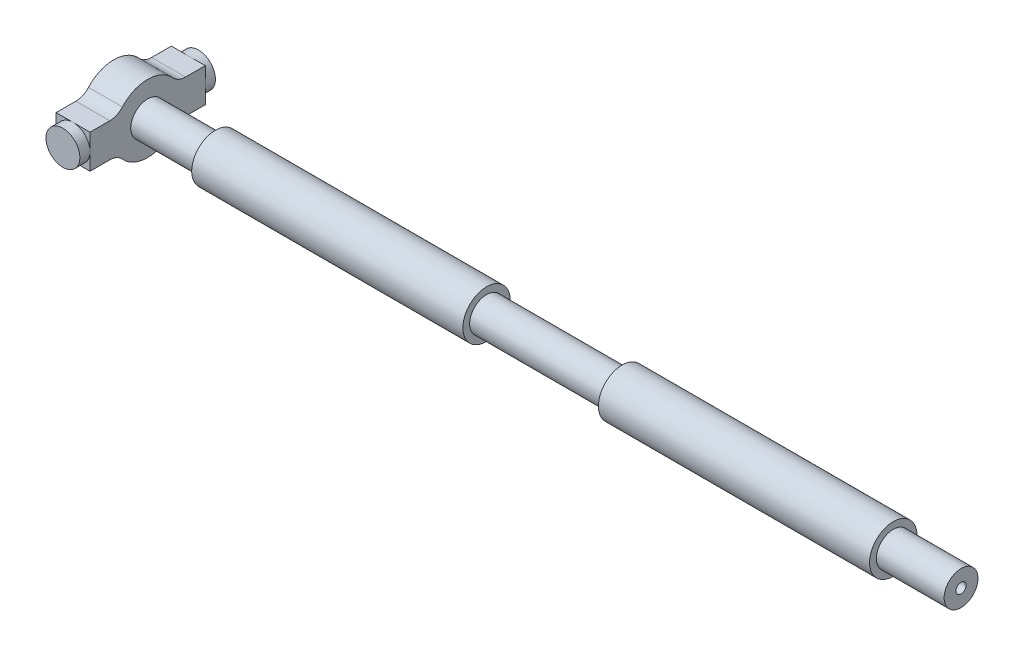
ISO-10303-21;
HEADER;
FILE_DESCRIPTION(('STEP AP214'),'2;1');
FILE_NAME('part.step','',(''),(''),'','','');
FILE_SCHEMA(('AUTOMOTIVE_DESIGN { 1 0 10303 214 1 1 1 1 }'));
ENDSEC;
DATA;
#1=APPLICATION_CONTEXT('core data for automotive mechanical design processes');
#2=APPLICATION_PROTOCOL_DEFINITION('international standard','automotive_design',2000,#1);
#3=PRODUCT_CONTEXT('',#1,'mechanical');
#4=PRODUCT('Part','Part','',(#3));
#5=PRODUCT_RELATED_PRODUCT_CATEGORY('part','',(#4));
#6=PRODUCT_DEFINITION_FORMATION('','',#4);
#7=PRODUCT_DEFINITION_CONTEXT('part definition',#1,'design');
#8=PRODUCT_DEFINITION('design','',#6,#7);
#9=PRODUCT_DEFINITION_SHAPE('','',#8);
#10=(LENGTH_UNIT() NAMED_UNIT(*) SI_UNIT(.MILLI.,.METRE.));
#11=(NAMED_UNIT(*) PLANE_ANGLE_UNIT() SI_UNIT($,.RADIAN.));
#12=(NAMED_UNIT(*) SI_UNIT($,.STERADIAN.) SOLID_ANGLE_UNIT());
#13=UNCERTAINTY_MEASURE_WITH_UNIT(LENGTH_MEASURE(1.E-05),#10,'distance_accuracy_value','');
#14=(GEOMETRIC_REPRESENTATION_CONTEXT(3) GLOBAL_UNCERTAINTY_ASSIGNED_CONTEXT((#13)) GLOBAL_UNIT_ASSIGNED_CONTEXT((#10,
#11,#12)) REPRESENTATION_CONTEXT('',''));
#15=CARTESIAN_POINT('',(0.,0.,0.));
#16=DIRECTION('',(0.,0.,1.));
#17=DIRECTION('',(1.,0.,0.));
#18=AXIS2_PLACEMENT_3D('',#15,#16,#17);
#19=CARTESIAN_POINT('',(5.,0.,-20.));
#20=DIRECTION('',(0.,0.,1.));
#21=DIRECTION('',(1.,0.,0.));
#22=AXIS2_PLACEMENT_3D('',#19,#20,#21);
#23=CYLINDRICAL_SURFACE('',#22,5.);
#24=CARTESIAN_POINT('',(5.,0.,-20.));
#25=DIRECTION('',(0.,0.,-1.));
#26=DIRECTION('',(-1.,0.,0.));
#27=AXIS2_PLACEMENT_3D('',#24,#25,#26);
#28=CIRCLE('',#27,5.);
#29=CARTESIAN_POINT('',(0.,0.,-20.));
#30=VERTEX_POINT('',#29);
#31=EDGE_CURVE('E11',#30,#30,#28,.T.);
#32=ORIENTED_EDGE('',*,*,#31,.F.);
#33=EDGE_LOOP('',(#32));
#34=FACE_BOUND('',#33,.T.);
#35=CARTESIAN_POINT('',(5.,0.,-17.));
#36=DIRECTION('',(0.,0.,-1.));
#37=DIRECTION('',(-1.,0.,0.));
#38=AXIS2_PLACEMENT_3D('',#35,#36,#37);
#39=CIRCLE('',#38,5.);
#40=CARTESIAN_POINT('',(0.,0.,-17.));
#41=VERTEX_POINT('',#40);
#42=EDGE_CURVE('E44',#41,#41,#39,.T.);
#43=ORIENTED_EDGE('',*,*,#42,.T.);
#44=EDGE_LOOP('',(#43));
#45=FACE_BOUND('',#44,.T.);
#46=ADVANCED_FACE('F41',(#34,#45),#23,.T.);
#47=CARTESIAN_POINT('',(5.,0.,-20.));
#48=DIRECTION('',(0.,0.,-1.));
#49=DIRECTION('',(-1.,0.,0.));
#50=AXIS2_PLACEMENT_3D('',#47,#48,#49);
#51=PLANE('',#50);
#52=ORIENTED_EDGE('',*,*,#31,.T.);
#53=EDGE_LOOP('',(#52));
#54=FACE_BOUND('',#53,.T.);
#55=ADVANCED_FACE('F56',(#54),#51,.T.);
#56=CARTESIAN_POINT('',(5.,0.,-17.));
#57=DIRECTION('',(0.,0.,-1.));
#58=DIRECTION('',(-1.,0.,0.));
#59=AXIS2_PLACEMENT_3D('',#56,#57,#58);
#60=PLANE('',#59);
#61=ORIENTED_EDGE('',*,*,#42,.F.);
#62=EDGE_LOOP('',(#61));
#63=FACE_BOUND('',#62,.T.);
#64=ADVANCED_FACE('F54',(#63),#60,.F.);
#65=CLOSED_SHELL('',(#46,#55,#64));
#66=MANIFOLD_SOLID_BREP('B2',#65);
#67=CARTESIAN_POINT('',(5.,0.,20.));
#68=DIRECTION('',(0.,0.,-1.));
#69=DIRECTION('',(-1.,0.,0.));
#70=AXIS2_PLACEMENT_3D('',#67,#68,#69);
#71=CYLINDRICAL_SURFACE('',#70,5.);
#72=CARTESIAN_POINT('',(5.,0.,20.));
#73=DIRECTION('',(0.,0.,1.));
#74=DIRECTION('',(1.,0.,0.));
#75=AXIS2_PLACEMENT_3D('',#72,#73,#74);
#76=CIRCLE('',#75,5.);
#77=CARTESIAN_POINT('',(10.,0.,20.));
#78=VERTEX_POINT('',#77);
#79=EDGE_CURVE('E40',#78,#78,#76,.T.);
#80=ORIENTED_EDGE('',*,*,#79,.F.);
#81=EDGE_LOOP('',(#80));
#82=FACE_BOUND('',#81,.T.);
#83=CARTESIAN_POINT('',(5.,0.,17.));
#84=DIRECTION('',(0.,0.,1.));
#85=DIRECTION('',(1.,0.,0.));
#86=AXIS2_PLACEMENT_3D('',#83,#84,#85);
#87=CIRCLE('',#86,5.);
#88=CARTESIAN_POINT('',(10.,0.,17.));
#89=VERTEX_POINT('',#88);
#90=EDGE_CURVE('E94',#89,#89,#87,.T.);
#91=ORIENTED_EDGE('',*,*,#90,.T.);
#92=EDGE_LOOP('',(#91));
#93=FACE_BOUND('',#92,.T.);
#94=ADVANCED_FACE('F91',(#82,#93),#71,.T.);
#95=CARTESIAN_POINT('',(5.,0.,20.));
#96=DIRECTION('',(0.,0.,1.));
#97=DIRECTION('',(1.,0.,0.));
#98=AXIS2_PLACEMENT_3D('',#95,#96,#97);
#99=PLANE('',#98);
#100=ORIENTED_EDGE('',*,*,#79,.T.);
#101=EDGE_LOOP('',(#100));
#102=FACE_BOUND('',#101,.T.);
#103=ADVANCED_FACE('F106',(#102),#99,.T.);
#104=CARTESIAN_POINT('',(5.,0.,17.));
#105=DIRECTION('',(0.,0.,1.));
#106=DIRECTION('',(1.,0.,0.));
#107=AXIS2_PLACEMENT_3D('',#104,#105,#106);
#108=PLANE('',#107);
#109=ORIENTED_EDGE('',*,*,#90,.F.);
#110=EDGE_LOOP('',(#109));
#111=FACE_BOUND('',#110,.T.);
#112=ADVANCED_FACE('F104',(#111),#108,.F.);
#113=CLOSED_SHELL('',(#94,#103,#112));
#114=MANIFOLD_SOLID_BREP('B6',#113);
#115=CARTESIAN_POINT('',(10.,-5.,8.66025403784439));
#116=DIRECTION('',(0.,-1.,0.));
#117=DIRECTION('',(0.,0.,-1.));
#118=AXIS2_PLACEMENT_3D('',#115,#116,#117);
#119=PLANE('',#118);
#120=DIRECTION('',(0.,0.,1.));
#121=VECTOR('',#120,1.);
#122=CARTESIAN_POINT('',(0.,-5.,8.66025403784439));
#123=LINE('',#122,#121);
#124=CARTESIAN_POINT('',(0.,-5.,11.180339887499));
#125=VERTEX_POINT('',#124);
#126=CARTESIAN_POINT('',(0.,-5.,17.));
#127=VERTEX_POINT('',#126);
#128=EDGE_CURVE('E266',#125,#127,#123,.T.);
#129=ORIENTED_EDGE('',*,*,#128,.F.);
#130=DIRECTION('',(1.,0.,0.));
#131=VECTOR('',#130,1.);
#132=CARTESIAN_POINT('',(10.,-5.,11.180339887499));
#133=LINE('',#132,#131);
#134=CARTESIAN_POINT('',(10.,-5.,11.180339887499));
#135=VERTEX_POINT('',#134);
#136=EDGE_CURVE('E231',#125,#135,#133,.T.);
#137=ORIENTED_EDGE('',*,*,#136,.T.);
#138=DIRECTION('',(0.,0.,1.));
#139=VECTOR('',#138,1.);
#140=CARTESIAN_POINT('',(10.,-5.,8.66025403784439));
#141=LINE('',#140,#139);
#142=CARTESIAN_POINT('',(10.,-5.,17.));
#143=VERTEX_POINT('',#142);
#144=EDGE_CURVE('E225',#135,#143,#141,.T.);
#145=ORIENTED_EDGE('',*,*,#144,.T.);
#146=DIRECTION('',(-1.,0.,0.));
#147=VECTOR('',#146,1.);
#148=CARTESIAN_POINT('',(10.,-5.,17.));
#149=LINE('',#148,#147);
#150=EDGE_CURVE('E228',#143,#127,#149,.T.);
#151=ORIENTED_EDGE('',*,*,#150,.T.);
#152=EDGE_LOOP('',(#129,#137,#145,#151));
#153=FACE_BOUND('',#152,.T.);
#154=ADVANCED_FACE('F138',(#153),#119,.T.);
#155=CARTESIAN_POINT('',(10.,0.,0.));
#156=DIRECTION('',(-1.,0.,0.));
#157=DIRECTION('',(0.,0.,1.));
#158=AXIS2_PLACEMENT_3D('',#155,#156,#157);
#159=CYLINDRICAL_SURFACE('',#158,10.);
#160=CARTESIAN_POINT('',(10.,0.,0.));
#161=DIRECTION('',(-1.,0.,0.));
#162=DIRECTION('',(0.,0.,1.));
#163=AXIS2_PLACEMENT_3D('',#160,#161,#162);
#164=CIRCLE('',#163,10.);
#165=CARTESIAN_POINT('',(10.,-6.66666666666667,-7.4535599249993));
#166=VERTEX_POINT('',#165);
#167=CARTESIAN_POINT('',(10.,-6.66666666666667,7.4535599249993));
#168=VERTEX_POINT('',#167);
#169=EDGE_CURVE('E244',#166,#168,#164,.T.);
#170=ORIENTED_EDGE('',*,*,#169,.T.);
#171=DIRECTION('',(-1.,0.,0.));
#172=VECTOR('',#171,1.);
#173=CARTESIAN_POINT('',(10.,-6.66666666666667,7.4535599249993));
#174=LINE('',#173,#172);
#175=CARTESIAN_POINT('',(0.,-6.66666666666667,7.4535599249993));
#176=VERTEX_POINT('',#175);
#177=EDGE_CURVE('E292',#168,#176,#174,.T.);
#178=ORIENTED_EDGE('',*,*,#177,.T.);
#179=CARTESIAN_POINT('',(0.,0.,0.));
#180=DIRECTION('',(-1.,0.,0.));
#181=DIRECTION('',(0.,0.,1.));
#182=AXIS2_PLACEMENT_3D('',#179,#180,#181);
#183=CIRCLE('',#182,10.);
#184=CARTESIAN_POINT('',(0.,-6.66666666666667,-7.4535599249993));
#185=VERTEX_POINT('',#184);
#186=EDGE_CURVE('E236',#185,#176,#183,.T.);
#187=ORIENTED_EDGE('',*,*,#186,.F.);
#188=DIRECTION('',(-1.,0.,0.));
#189=VECTOR('',#188,1.);
#190=CARTESIAN_POINT('',(10.,-6.66666666666667,-7.4535599249993));
#191=LINE('',#190,#189);
#192=EDGE_CURVE('E286',#185,#166,#191,.F.);
#193=ORIENTED_EDGE('',*,*,#192,.T.);
#194=EDGE_LOOP('',(#170,#178,#187,#193));
#195=FACE_BOUND('',#194,.T.);
#196=ADVANCED_FACE('F353',(#195),#159,.T.);
#197=CARTESIAN_POINT('',(10.,-5.,-17.));
#198=DIRECTION('',(0.,-1.,0.));
#199=DIRECTION('',(0.,0.,-1.));
#200=AXIS2_PLACEMENT_3D('',#197,#198,#199);
#201=PLANE('',#200);
#202=DIRECTION('',(0.,0.,1.));
#203=VECTOR('',#202,1.);
#204=CARTESIAN_POINT('',(10.,-5.,-17.));
#205=LINE('',#204,#203);
#206=CARTESIAN_POINT('',(10.,-5.,-17.));
#207=VERTEX_POINT('',#206);
#208=CARTESIAN_POINT('',(10.,-5.,-11.1803398874989));
#209=VERTEX_POINT('',#208);
#210=EDGE_CURVE('E261',#207,#209,#205,.T.);
#211=ORIENTED_EDGE('',*,*,#210,.T.);
#212=DIRECTION('',(1.,0.,0.));
#213=VECTOR('',#212,1.);
#214=CARTESIAN_POINT('',(0.,-5.,-11.1803398874989));
#215=LINE('',#214,#213);
#216=CARTESIAN_POINT('',(0.,-5.,-11.1803398874989));
#217=VERTEX_POINT('',#216);
#218=EDGE_CURVE('E296',#209,#217,#215,.F.);
#219=ORIENTED_EDGE('',*,*,#218,.T.);
#220=DIRECTION('',(0.,0.,1.));
#221=VECTOR('',#220,1.);
#222=CARTESIAN_POINT('',(0.,-5.,-17.));
#223=LINE('',#222,#221);
#224=CARTESIAN_POINT('',(0.,-5.,-17.));
#225=VERTEX_POINT('',#224);
#226=EDGE_CURVE('E279',#225,#217,#223,.T.);
#227=ORIENTED_EDGE('',*,*,#226,.F.);
#228=DIRECTION('',(-1.,0.,0.));
#229=VECTOR('',#228,1.);
#230=CARTESIAN_POINT('',(10.,-5.,-17.));
#231=LINE('',#230,#229);
#232=EDGE_CURVE('E284',#207,#225,#231,.T.);
#233=ORIENTED_EDGE('',*,*,#232,.F.);
#234=EDGE_LOOP('',(#211,#219,#227,#233));
#235=FACE_BOUND('',#234,.T.);
#236=ADVANCED_FACE('F345',(#235),#201,.T.);
#237=CARTESIAN_POINT('',(10.,5.,-17.));
#238=DIRECTION('',(0.,0.,-1.));
#239=DIRECTION('',(-1.,0.,0.));
#240=AXIS2_PLACEMENT_3D('',#237,#238,#239);
#241=PLANE('',#240);
#242=DIRECTION('',(0.,-1.,0.));
#243=VECTOR('',#242,1.);
#244=CARTESIAN_POINT('',(0.,5.,-17.));
#245=LINE('',#244,#243);
#246=CARTESIAN_POINT('',(0.,5.,-17.));
#247=VERTEX_POINT('',#246);
#248=EDGE_CURVE('E276',#247,#225,#245,.T.);
#249=ORIENTED_EDGE('',*,*,#248,.F.);
#250=DIRECTION('',(-1.,0.,0.));
#251=VECTOR('',#250,1.);
#252=CARTESIAN_POINT('',(10.,5.,-17.));
#253=LINE('',#252,#251);
#254=CARTESIAN_POINT('',(10.,5.,-17.));
#255=VERTEX_POINT('',#254);
#256=EDGE_CURVE('E287',#255,#247,#253,.T.);
#257=ORIENTED_EDGE('',*,*,#256,.F.);
#258=DIRECTION('',(0.,-1.,0.));
#259=VECTOR('',#258,1.);
#260=CARTESIAN_POINT('',(10.,5.,-17.));
#261=LINE('',#260,#259);
#262=EDGE_CURVE('E258',#255,#207,#261,.T.);
#263=ORIENTED_EDGE('',*,*,#262,.T.);
#264=ORIENTED_EDGE('',*,*,#232,.T.);
#265=EDGE_LOOP('',(#249,#257,#263,#264));
#266=FACE_BOUND('',#265,.T.);
#267=ADVANCED_FACE('F341',(#266),#241,.T.);
#268=CARTESIAN_POINT('',(10.,5.,-17.));
#269=DIRECTION('',(0.,1.,0.));
#270=DIRECTION('',(0.,0.,1.));
#271=AXIS2_PLACEMENT_3D('',#268,#269,#270);
#272=PLANE('',#271);
#273=DIRECTION('',(0.,0.,-1.));
#274=VECTOR('',#273,1.);
#275=CARTESIAN_POINT('',(0.,5.,-17.));
#276=LINE('',#275,#274);
#277=CARTESIAN_POINT('',(0.,5.,-11.1803398874989));
#278=VERTEX_POINT('',#277);
#279=EDGE_CURVE('E274',#278,#247,#276,.T.);
#280=ORIENTED_EDGE('',*,*,#279,.F.);
#281=DIRECTION('',(1.,0.,0.));
#282=VECTOR('',#281,1.);
#283=CARTESIAN_POINT('',(10.,5.,-11.1803398874989));
#284=LINE('',#283,#282);
#285=CARTESIAN_POINT('',(10.,5.,-11.1803398874989));
#286=VERTEX_POINT('',#285);
#287=EDGE_CURVE('E153',#278,#286,#284,.T.);
#288=ORIENTED_EDGE('',*,*,#287,.T.);
#289=DIRECTION('',(0.,0.,-1.));
#290=VECTOR('',#289,1.);
#291=CARTESIAN_POINT('',(10.,5.,-17.));
#292=LINE('',#291,#290);
#293=EDGE_CURVE('E256',#286,#255,#292,.T.);
#294=ORIENTED_EDGE('',*,*,#293,.T.);
#295=ORIENTED_EDGE('',*,*,#256,.T.);
#296=EDGE_LOOP('',(#280,#288,#294,#295));
#297=FACE_BOUND('',#296,.T.);
#298=ADVANCED_FACE('F338',(#297),#272,.T.);
#299=CARTESIAN_POINT('',(10.,0.,0.));
#300=DIRECTION('',(-1.,0.,0.));
#301=DIRECTION('',(0.,0.,1.));
#302=AXIS2_PLACEMENT_3D('',#299,#300,#301);
#303=CYLINDRICAL_SURFACE('',#302,10.);
#304=CARTESIAN_POINT('',(0.,0.,0.));
#305=DIRECTION('',(-1.,0.,0.));
#306=DIRECTION('',(0.,0.,1.));
#307=AXIS2_PLACEMENT_3D('',#304,#305,#306);
#308=CIRCLE('',#307,10.);
#309=CARTESIAN_POINT('',(0.,6.66666666666667,7.4535599249993));
#310=VERTEX_POINT('',#309);
#311=CARTESIAN_POINT('',(0.,6.66666666666667,-7.4535599249993));
#312=VERTEX_POINT('',#311);
#313=EDGE_CURVE('E272',#310,#312,#308,.T.);
#314=ORIENTED_EDGE('',*,*,#313,.F.);
#315=DIRECTION('',(-1.,0.,0.));
#316=VECTOR('',#315,1.);
#317=CARTESIAN_POINT('',(10.,6.66666666666667,7.4535599249993));
#318=LINE('',#317,#316);
#319=CARTESIAN_POINT('',(10.,6.66666666666667,7.4535599249993));
#320=VERTEX_POINT('',#319);
#321=EDGE_CURVE('E305',#310,#320,#318,.F.);
#322=ORIENTED_EDGE('',*,*,#321,.T.);
#323=CARTESIAN_POINT('',(10.,0.,0.));
#324=DIRECTION('',(-1.,0.,0.));
#325=DIRECTION('',(0.,0.,1.));
#326=AXIS2_PLACEMENT_3D('',#323,#324,#325);
#327=CIRCLE('',#326,10.);
#328=CARTESIAN_POINT('',(10.,6.66666666666667,-7.4535599249993));
#329=VERTEX_POINT('',#328);
#330=EDGE_CURVE('E251',#320,#329,#327,.T.);
#331=ORIENTED_EDGE('',*,*,#330,.T.);
#332=DIRECTION('',(-1.,0.,0.));
#333=VECTOR('',#332,1.);
#334=CARTESIAN_POINT('',(10.,6.66666666666667,-7.4535599249993));
#335=LINE('',#334,#333);
#336=EDGE_CURVE('E302',#329,#312,#335,.T.);
#337=ORIENTED_EDGE('',*,*,#336,.T.);
#338=EDGE_LOOP('',(#314,#322,#331,#337));
#339=FACE_BOUND('',#338,.T.);
#340=ADVANCED_FACE('F331',(#339),#303,.T.);
#341=CARTESIAN_POINT('',(10.,5.,8.66025403784439));
#342=DIRECTION('',(0.,1.,0.));
#343=DIRECTION('',(0.,0.,1.));
#344=AXIS2_PLACEMENT_3D('',#341,#342,#343);
#345=PLANE('',#344);
#346=DIRECTION('',(0.,0.,-1.));
#347=VECTOR('',#346,1.);
#348=CARTESIAN_POINT('',(10.,5.,8.66025403784439));
#349=LINE('',#348,#347);
#350=CARTESIAN_POINT('',(10.,5.,17.));
#351=VERTEX_POINT('',#350);
#352=CARTESIAN_POINT('',(10.,5.,11.1803398874989));
#353=VERTEX_POINT('',#352);
#354=EDGE_CURVE('E249',#351,#353,#349,.T.);
#355=ORIENTED_EDGE('',*,*,#354,.T.);
#356=DIRECTION('',(1.,0.,0.));
#357=VECTOR('',#356,1.);
#358=CARTESIAN_POINT('',(0.,5.,11.1803398874989));
#359=LINE('',#358,#357);
#360=CARTESIAN_POINT('',(0.,5.,11.1803398874989));
#361=VERTEX_POINT('',#360);
#362=EDGE_CURVE('E299',#353,#361,#359,.F.);
#363=ORIENTED_EDGE('',*,*,#362,.T.);
#364=DIRECTION('',(0.,0.,-1.));
#365=VECTOR('',#364,1.);
#366=CARTESIAN_POINT('',(0.,5.,8.66025403784439));
#367=LINE('',#366,#365);
#368=CARTESIAN_POINT('',(0.,5.,17.));
#369=VERTEX_POINT('',#368);
#370=EDGE_CURVE('E269',#369,#361,#367,.T.);
#371=ORIENTED_EDGE('',*,*,#370,.F.);
#372=DIRECTION('',(-1.,0.,0.));
#373=VECTOR('',#372,1.);
#374=CARTESIAN_POINT('',(10.,5.,17.));
#375=LINE('',#374,#373);
#376=EDGE_CURVE('E243',#351,#369,#375,.T.);
#377=ORIENTED_EDGE('',*,*,#376,.F.);
#378=EDGE_LOOP('',(#355,#363,#371,#377));
#379=FACE_BOUND('',#378,.T.);
#380=ADVANCED_FACE('F325',(#379),#345,.T.);
#381=CARTESIAN_POINT('',(10.,5.,17.));
#382=DIRECTION('',(0.,0.,1.));
#383=DIRECTION('',(1.,0.,0.));
#384=AXIS2_PLACEMENT_3D('',#381,#382,#383);
#385=PLANE('',#384);
#386=DIRECTION('',(0.,1.,0.));
#387=VECTOR('',#386,1.);
#388=CARTESIAN_POINT('',(0.,5.,17.));
#389=LINE('',#388,#387);
#390=EDGE_CURVE('E242',#127,#369,#389,.T.);
#391=ORIENTED_EDGE('',*,*,#390,.F.);
#392=ORIENTED_EDGE('',*,*,#150,.F.);
#393=DIRECTION('',(0.,1.,0.));
#394=VECTOR('',#393,1.);
#395=CARTESIAN_POINT('',(10.,5.,17.));
#396=LINE('',#395,#394);
#397=EDGE_CURVE('E235',#143,#351,#396,.T.);
#398=ORIENTED_EDGE('',*,*,#397,.T.);
#399=ORIENTED_EDGE('',*,*,#376,.T.);
#400=EDGE_LOOP('',(#391,#392,#398,#399));
#401=FACE_BOUND('',#400,.T.);
#402=ADVANCED_FACE('F240',(#401),#385,.T.);
#403=CARTESIAN_POINT('',(10.,0.,0.));
#404=DIRECTION('',(-1.,0.,0.));
#405=DIRECTION('',(0.,0.,1.));
#406=AXIS2_PLACEMENT_3D('',#403,#404,#405);
#407=PLANE('',#406);
#408=ORIENTED_EDGE('',*,*,#144,.F.);
#409=CARTESIAN_POINT('',(10.,-10.,11.180339887499));
#410=DIRECTION('',(-1.,0.,0.));
#411=DIRECTION('',(0.,0.,1.));
#412=AXIS2_PLACEMENT_3D('',#409,#410,#411);
#413=CIRCLE('',#412,5.);
#414=EDGE_CURVE('E310',#135,#168,#413,.T.);
#415=ORIENTED_EDGE('',*,*,#414,.T.);
#416=ORIENTED_EDGE('',*,*,#169,.F.);
#417=CARTESIAN_POINT('',(10.,-10.,-11.1803398874989));
#418=DIRECTION('',(-1.,0.,0.));
#419=DIRECTION('',(0.,0.,1.));
#420=AXIS2_PLACEMENT_3D('',#417,#418,#419);
#421=CIRCLE('',#420,5.);
#422=EDGE_CURVE('E314',#166,#209,#421,.T.);
#423=ORIENTED_EDGE('',*,*,#422,.T.);
#424=ORIENTED_EDGE('',*,*,#210,.F.);
#425=ORIENTED_EDGE('',*,*,#262,.F.);
#426=ORIENTED_EDGE('',*,*,#293,.F.);
#427=CARTESIAN_POINT('',(10.,10.,-11.1803398874989));
#428=DIRECTION('',(-1.,0.,0.));
#429=DIRECTION('',(0.,0.,1.));
#430=AXIS2_PLACEMENT_3D('',#427,#428,#429);
#431=CIRCLE('',#430,5.);
#432=EDGE_CURVE('E89',#286,#329,#431,.T.);
#433=ORIENTED_EDGE('',*,*,#432,.T.);
#434=ORIENTED_EDGE('',*,*,#330,.F.);
#435=CARTESIAN_POINT('',(10.,10.,11.1803398874989));
#436=DIRECTION('',(-1.,0.,0.));
#437=DIRECTION('',(0.,0.,1.));
#438=AXIS2_PLACEMENT_3D('',#435,#436,#437);
#439=CIRCLE('',#438,5.);
#440=EDGE_CURVE('E318',#320,#353,#439,.T.);
#441=ORIENTED_EDGE('',*,*,#440,.T.);
#442=ORIENTED_EDGE('',*,*,#354,.F.);
#443=ORIENTED_EDGE('',*,*,#397,.F.);
#444=EDGE_LOOP('',(#408,#415,#416,#423,#424,#425,#426,#433,#434,#441,#442,#443));
#445=FACE_BOUND('',#444,.T.);
#446=ADVANCED_FACE('F247',(#445),#407,.F.);
#447=CARTESIAN_POINT('',(0.,0.,0.));
#448=DIRECTION('',(-1.,0.,0.));
#449=DIRECTION('',(0.,0.,1.));
#450=AXIS2_PLACEMENT_3D('',#447,#448,#449);
#451=PLANE('',#450);
#452=ORIENTED_EDGE('',*,*,#186,.T.);
#453=CARTESIAN_POINT('',(0.,-10.,11.180339887499));
#454=DIRECTION('',(-1.,0.,0.));
#455=DIRECTION('',(0.,0.,1.));
#456=AXIS2_PLACEMENT_3D('',#453,#454,#455);
#457=CIRCLE('',#456,5.);
#458=EDGE_CURVE('E308',#176,#125,#457,.F.);
#459=ORIENTED_EDGE('',*,*,#458,.T.);
#460=ORIENTED_EDGE('',*,*,#128,.T.);
#461=ORIENTED_EDGE('',*,*,#390,.T.);
#462=ORIENTED_EDGE('',*,*,#370,.T.);
#463=CARTESIAN_POINT('',(0.,10.,11.1803398874989));
#464=DIRECTION('',(-1.,0.,0.));
#465=DIRECTION('',(0.,0.,1.));
#466=AXIS2_PLACEMENT_3D('',#463,#464,#465);
#467=CIRCLE('',#466,5.);
#468=EDGE_CURVE('E316',#361,#310,#467,.F.);
#469=ORIENTED_EDGE('',*,*,#468,.T.);
#470=ORIENTED_EDGE('',*,*,#313,.T.);
#471=CARTESIAN_POINT('',(0.,10.,-11.1803398874989));
#472=DIRECTION('',(-1.,0.,0.));
#473=DIRECTION('',(0.,0.,1.));
#474=AXIS2_PLACEMENT_3D('',#471,#472,#473);
#475=CIRCLE('',#474,5.);
#476=EDGE_CURVE('E146',#312,#278,#475,.F.);
#477=ORIENTED_EDGE('',*,*,#476,.T.);
#478=ORIENTED_EDGE('',*,*,#279,.T.);
#479=ORIENTED_EDGE('',*,*,#248,.T.);
#480=ORIENTED_EDGE('',*,*,#226,.T.);
#481=CARTESIAN_POINT('',(0.,-10.,-11.1803398874989));
#482=DIRECTION('',(-1.,0.,0.));
#483=DIRECTION('',(0.,0.,1.));
#484=AXIS2_PLACEMENT_3D('',#481,#482,#483);
#485=CIRCLE('',#484,5.);
#486=EDGE_CURVE('E312',#217,#185,#485,.F.);
#487=ORIENTED_EDGE('',*,*,#486,.T.);
#488=EDGE_LOOP('',(#452,#459,#460,#461,#462,#469,#470,#477,#478,#479,#480,#487));
#489=FACE_BOUND('',#488,.T.);
#490=ADVANCED_FACE('F329',(#489),#451,.T.);
#491=CARTESIAN_POINT('',(10.,-10.,11.180339887499));
#492=DIRECTION('',(-1.,0.,0.));
#493=DIRECTION('',(0.,0.,1.));
#494=AXIS2_PLACEMENT_3D('',#491,#492,#493);
#495=CYLINDRICAL_SURFACE('',#494,5.);
#496=ORIENTED_EDGE('',*,*,#414,.F.);
#497=ORIENTED_EDGE('',*,*,#136,.F.);
#498=ORIENTED_EDGE('',*,*,#458,.F.);
#499=ORIENTED_EDGE('',*,*,#177,.F.);
#500=EDGE_LOOP('',(#496,#497,#498,#499));
#501=FACE_BOUND('',#500,.T.);
#502=ADVANCED_FACE('F356',(#501),#495,.F.);
#503=CARTESIAN_POINT('',(10.,-10.,-11.1803398874989));
#504=DIRECTION('',(-1.,0.,0.));
#505=DIRECTION('',(0.,0.,1.));
#506=AXIS2_PLACEMENT_3D('',#503,#504,#505);
#507=CYLINDRICAL_SURFACE('',#506,5.);
#508=ORIENTED_EDGE('',*,*,#422,.F.);
#509=ORIENTED_EDGE('',*,*,#192,.F.);
#510=ORIENTED_EDGE('',*,*,#486,.F.);
#511=ORIENTED_EDGE('',*,*,#218,.F.);
#512=EDGE_LOOP('',(#508,#509,#510,#511));
#513=FACE_BOUND('',#512,.T.);
#514=ADVANCED_FACE('F349',(#513),#507,.F.);
#515=CARTESIAN_POINT('',(10.,10.,11.1803398874989));
#516=DIRECTION('',(-1.,0.,0.));
#517=DIRECTION('',(0.,0.,1.));
#518=AXIS2_PLACEMENT_3D('',#515,#516,#517);
#519=CYLINDRICAL_SURFACE('',#518,5.);
#520=ORIENTED_EDGE('',*,*,#440,.F.);
#521=ORIENTED_EDGE('',*,*,#321,.F.);
#522=ORIENTED_EDGE('',*,*,#468,.F.);
#523=ORIENTED_EDGE('',*,*,#362,.F.);
#524=EDGE_LOOP('',(#520,#521,#522,#523));
#525=FACE_BOUND('',#524,.T.);
#526=ADVANCED_FACE('F327',(#525),#519,.F.);
#527=CARTESIAN_POINT('',(10.,10.,-11.1803398874989));
#528=DIRECTION('',(-1.,0.,0.));
#529=DIRECTION('',(0.,0.,1.));
#530=AXIS2_PLACEMENT_3D('',#527,#528,#529);
#531=CYLINDRICAL_SURFACE('',#530,5.);
#532=ORIENTED_EDGE('',*,*,#432,.F.);
#533=ORIENTED_EDGE('',*,*,#287,.F.);
#534=ORIENTED_EDGE('',*,*,#476,.F.);
#535=ORIENTED_EDGE('',*,*,#336,.F.);
#536=EDGE_LOOP('',(#532,#533,#534,#535));
#537=FACE_BOUND('',#536,.T.);
#538=ADVANCED_FACE('F140',(#537),#531,.F.);
#539=CLOSED_SHELL('',(#154,#196,#236,#267,#298,#340,#380,#402,#446,#490,#502,#514,#526,#538));
#540=MANIFOLD_SOLID_BREP('B35',#539);
#541=CARTESIAN_POINT('',(250.,0.,0.));
#542=DIRECTION('',(-1.,0.,0.));
#543=DIRECTION('',(0.,0.,1.));
#544=AXIS2_PLACEMENT_3D('',#541,#542,#543);
#545=CYLINDRICAL_SURFACE('',#544,5.);
#546=CARTESIAN_POINT('',(110.,0.,0.));
#547=DIRECTION('',(1.,0.,0.));
#548=DIRECTION('',(0.,0.,-1.));
#549=AXIS2_PLACEMENT_3D('',#546,#547,#548);
#550=CIRCLE('',#549,5.);
#551=CARTESIAN_POINT('',(110.,0.,-5.));
#552=VERTEX_POINT('',#551);
#553=EDGE_CURVE('E490',#552,#552,#550,.T.);
#554=ORIENTED_EDGE('',*,*,#553,.T.);
#555=EDGE_LOOP('',(#554));
#556=FACE_BOUND('',#555,.T.);
#557=CARTESIAN_POINT('',(150.,0.,0.));
#558=DIRECTION('',(1.,0.,0.));
#559=DIRECTION('',(0.,0.,-1.));
#560=AXIS2_PLACEMENT_3D('',#557,#558,#559);
#561=CIRCLE('',#560,5.);
#562=CARTESIAN_POINT('',(150.,0.,-5.));
#563=VERTEX_POINT('',#562);
#564=EDGE_CURVE('E476',#563,#563,#561,.T.);
#565=ORIENTED_EDGE('',*,*,#564,.F.);
#566=EDGE_LOOP('',(#565));
#567=FACE_BOUND('',#566,.T.);
#568=ADVANCED_FACE('F469',(#556,#567),#545,.T.);
#569=CARTESIAN_POINT('',(150.,0.,0.));
#570=DIRECTION('',(1.,0.,0.));
#571=DIRECTION('',(0.,0.,-1.));
#572=AXIS2_PLACEMENT_3D('',#569,#570,#571);
#573=CYLINDRICAL_SURFACE('',#572,7.);
#574=CARTESIAN_POINT('',(150.,0.,0.));
#575=DIRECTION('',(1.,0.,0.));
#576=DIRECTION('',(0.,0.,-1.));
#577=AXIS2_PLACEMENT_3D('',#574,#575,#576);
#578=CIRCLE('',#577,7.);
#579=CARTESIAN_POINT('',(150.,0.,-7.));
#580=VERTEX_POINT('',#579);
#581=EDGE_CURVE('E497',#580,#580,#578,.T.);
#582=ORIENTED_EDGE('',*,*,#581,.T.);
#583=EDGE_LOOP('',(#582));
#584=FACE_BOUND('',#583,.T.);
#585=CARTESIAN_POINT('',(230.,0.,0.));
#586=DIRECTION('',(1.,0.,0.));
#587=DIRECTION('',(0.,0.,-1.));
#588=AXIS2_PLACEMENT_3D('',#585,#586,#587);
#589=CIRCLE('',#588,7.);
#590=CARTESIAN_POINT('',(230.,0.,-7.));
#591=VERTEX_POINT('',#590);
#592=EDGE_CURVE('E492',#591,#591,#589,.T.);
#593=ORIENTED_EDGE('',*,*,#592,.F.);
#594=EDGE_LOOP('',(#593));
#595=FACE_BOUND('',#594,.T.);
#596=ADVANCED_FACE('F528',(#584,#595),#573,.T.);
#597=CARTESIAN_POINT('',(150.,0.,0.));
#598=DIRECTION('',(1.,0.,0.));
#599=DIRECTION('',(0.,0.,-1.));
#600=AXIS2_PLACEMENT_3D('',#597,#598,#599);
#601=PLANE('',#600);
#602=ORIENTED_EDGE('',*,*,#564,.T.);
#603=EDGE_LOOP('',(#602));
#604=FACE_BOUND('',#603,.T.);
#605=ORIENTED_EDGE('',*,*,#581,.F.);
#606=EDGE_LOOP('',(#605));
#607=FACE_BOUND('',#606,.T.);
#608=ADVANCED_FACE('F524',(#604,#607),#601,.F.);
#609=CARTESIAN_POINT('',(230.,0.,0.));
#610=DIRECTION('',(1.,0.,0.));
#611=DIRECTION('',(0.,0.,-1.));
#612=AXIS2_PLACEMENT_3D('',#609,#610,#611);
#613=PLANE('',#612);
#614=CARTESIAN_POINT('',(230.,0.,0.));
#615=DIRECTION('',(1.,0.,0.));
#616=DIRECTION('',(0.,0.,-1.));
#617=AXIS2_PLACEMENT_3D('',#614,#615,#616);
#618=CIRCLE('',#617,5.);
#619=CARTESIAN_POINT('',(230.,0.,-5.));
#620=VERTEX_POINT('',#619);
#621=EDGE_CURVE('E488',#620,#620,#618,.T.);
#622=ORIENTED_EDGE('',*,*,#621,.F.);
#623=EDGE_LOOP('',(#622));
#624=FACE_BOUND('',#623,.T.);
#625=ORIENTED_EDGE('',*,*,#592,.T.);
#626=EDGE_LOOP('',(#625));
#627=FACE_BOUND('',#626,.T.);
#628=ADVANCED_FACE('F520',(#624,#627),#613,.T.);
#629=CARTESIAN_POINT('',(250.,0.,0.));
#630=DIRECTION('',(1.,0.,0.));
#631=DIRECTION('',(0.,0.,-1.));
#632=AXIS2_PLACEMENT_3D('',#629,#630,#631);
#633=PLANE('',#632);
#634=CARTESIAN_POINT('',(250.,0.,0.));
#635=DIRECTION('',(1.,0.,0.));
#636=DIRECTION('',(0.,0.,-1.));
#637=AXIS2_PLACEMENT_3D('',#634,#635,#636);
#638=CIRCLE('',#637,1.5);
#639=CARTESIAN_POINT('',(250.,0.,-1.5));
#640=VERTEX_POINT('',#639);
#641=EDGE_CURVE('E508',#640,#640,#638,.T.);
#642=ORIENTED_EDGE('',*,*,#641,.F.);
#643=EDGE_LOOP('',(#642));
#644=FACE_BOUND('',#643,.T.);
#645=CARTESIAN_POINT('',(250.,0.,0.));
#646=DIRECTION('',(1.,0.,0.));
#647=DIRECTION('',(0.,0.,-1.));
#648=AXIS2_PLACEMENT_3D('',#645,#646,#647);
#649=CIRCLE('',#648,5.);
#650=CARTESIAN_POINT('',(250.,0.,-5.));
#651=VERTEX_POINT('',#650);
#652=EDGE_CURVE('E480',#651,#651,#649,.T.);
#653=ORIENTED_EDGE('',*,*,#652,.T.);
#654=EDGE_LOOP('',(#653));
#655=FACE_BOUND('',#654,.T.);
#656=ADVANCED_FACE('F523',(#644,#655),#633,.T.);
#657=ORIENTED_EDGE('',*,*,#621,.T.);
#658=EDGE_LOOP('',(#657));
#659=FACE_BOUND('',#658,.T.);
#660=ORIENTED_EDGE('',*,*,#652,.F.);
#661=EDGE_LOOP('',(#660));
#662=FACE_BOUND('',#661,.T.);
#663=ADVANCED_FACE('F471',(#659,#662),#545,.T.);
#664=CARTESIAN_POINT('',(30.,0.,0.));
#665=DIRECTION('',(1.,0.,0.));
#666=DIRECTION('',(0.,0.,-1.));
#667=AXIS2_PLACEMENT_3D('',#664,#665,#666);
#668=CYLINDRICAL_SURFACE('',#667,7.);
#669=CARTESIAN_POINT('',(30.,0.,0.));
#670=DIRECTION('',(1.,0.,0.));
#671=DIRECTION('',(0.,0.,-1.));
#672=AXIS2_PLACEMENT_3D('',#669,#670,#671);
#673=CIRCLE('',#672,7.);
#674=CARTESIAN_POINT('',(30.,0.,-7.));
#675=VERTEX_POINT('',#674);
#676=EDGE_CURVE('E493',#675,#675,#673,.T.);
#677=ORIENTED_EDGE('',*,*,#676,.T.);
#678=EDGE_LOOP('',(#677));
#679=FACE_BOUND('',#678,.T.);
#680=CARTESIAN_POINT('',(110.,0.,0.));
#681=DIRECTION('',(1.,0.,0.));
#682=DIRECTION('',(0.,0.,-1.));
#683=AXIS2_PLACEMENT_3D('',#680,#681,#682);
#684=CIRCLE('',#683,7.);
#685=CARTESIAN_POINT('',(110.,0.,-7.));
#686=VERTEX_POINT('',#685);
#687=EDGE_CURVE('E500',#686,#686,#684,.T.);
#688=ORIENTED_EDGE('',*,*,#687,.F.);
#689=EDGE_LOOP('',(#688));
#690=FACE_BOUND('',#689,.T.);
#691=ADVANCED_FACE('F556',(#679,#690),#668,.T.);
#692=CARTESIAN_POINT('',(30.,0.,0.));
#693=DIRECTION('',(1.,0.,0.));
#694=DIRECTION('',(0.,0.,-1.));
#695=AXIS2_PLACEMENT_3D('',#692,#693,#694);
#696=PLANE('',#695);
#697=CARTESIAN_POINT('',(30.,0.,0.));
#698=DIRECTION('',(1.,0.,0.));
#699=DIRECTION('',(0.,0.,-1.));
#700=AXIS2_PLACEMENT_3D('',#697,#698,#699);
#701=CIRCLE('',#700,5.);
#702=CARTESIAN_POINT('',(30.,0.,-5.));
#703=VERTEX_POINT('',#702);
#704=EDGE_CURVE('E137',#703,#703,#701,.T.);
#705=ORIENTED_EDGE('',*,*,#704,.T.);
#706=EDGE_LOOP('',(#705));
#707=FACE_BOUND('',#706,.T.);
#708=ORIENTED_EDGE('',*,*,#676,.F.);
#709=EDGE_LOOP('',(#708));
#710=FACE_BOUND('',#709,.T.);
#711=ADVANCED_FACE('F550',(#707,#710),#696,.F.);
#712=CARTESIAN_POINT('',(110.,0.,0.));
#713=DIRECTION('',(1.,0.,0.));
#714=DIRECTION('',(0.,0.,-1.));
#715=AXIS2_PLACEMENT_3D('',#712,#713,#714);
#716=PLANE('',#715);
#717=ORIENTED_EDGE('',*,*,#553,.F.);
#718=EDGE_LOOP('',(#717));
#719=FACE_BOUND('',#718,.T.);
#720=ORIENTED_EDGE('',*,*,#687,.T.);
#721=EDGE_LOOP('',(#720));
#722=FACE_BOUND('',#721,.T.);
#723=ADVANCED_FACE('F543',(#719,#722),#716,.T.);
#724=CARTESIAN_POINT('',(0.,0.,0.));
#725=DIRECTION('',(1.,0.,0.));
#726=DIRECTION('',(0.,0.,-1.));
#727=AXIS2_PLACEMENT_3D('',#724,#725,#726);
#728=PLANE('',#727);
#729=CARTESIAN_POINT('',(0.,0.,0.));
#730=DIRECTION('',(1.,0.,0.));
#731=DIRECTION('',(0.,0.,-1.));
#732=AXIS2_PLACEMENT_3D('',#729,#730,#731);
#733=CIRCLE('',#732,5.);
#734=CARTESIAN_POINT('',(0.,0.,-5.));
#735=VERTEX_POINT('',#734);
#736=EDGE_CURVE('E485',#735,#735,#733,.T.);
#737=ORIENTED_EDGE('',*,*,#736,.F.);
#738=EDGE_LOOP('',(#737));
#739=FACE_BOUND('',#738,.T.);
#740=ADVANCED_FACE('F541',(#739),#728,.F.);
#741=ORIENTED_EDGE('',*,*,#736,.T.);
#742=EDGE_LOOP('',(#741));
#743=FACE_BOUND('',#742,.T.);
#744=ORIENTED_EDGE('',*,*,#704,.F.);
#745=EDGE_LOOP('',(#744));
#746=FACE_BOUND('',#745,.T.);
#747=ADVANCED_FACE('F537',(#743,#746),#545,.T.);
#748=CARTESIAN_POINT('',(150.,0.,0.));
#749=DIRECTION('',(1.,0.,0.));
#750=DIRECTION('',(0.,0.,-1.));
#751=AXIS2_PLACEMENT_3D('',#748,#749,#750);
#752=CYLINDRICAL_SURFACE('',#751,1.5);
#753=CARTESIAN_POINT('',(150.,0.,0.));
#754=DIRECTION('',(1.,0.,0.));
#755=DIRECTION('',(0.,0.,-1.));
#756=AXIS2_PLACEMENT_3D('',#753,#754,#755);
#757=CIRCLE('',#756,1.5);
#758=CARTESIAN_POINT('',(150.,0.,-1.5));
#759=VERTEX_POINT('',#758);
#760=EDGE_CURVE('E505',#759,#759,#757,.T.);
#761=ORIENTED_EDGE('',*,*,#760,.F.);
#762=EDGE_LOOP('',(#761));
#763=FACE_BOUND('',#762,.T.);
#764=ORIENTED_EDGE('',*,*,#641,.T.);
#765=EDGE_LOOP('',(#764));
#766=FACE_BOUND('',#765,.T.);
#767=ADVANCED_FACE('F549',(#763,#766),#752,.F.);
#768=CARTESIAN_POINT('',(150.,0.,0.));
#769=DIRECTION('',(1.,0.,0.));
#770=DIRECTION('',(0.,0.,-1.));
#771=AXIS2_PLACEMENT_3D('',#768,#769,#770);
#772=PLANE('',#771);
#773=ORIENTED_EDGE('',*,*,#760,.T.);
#774=EDGE_LOOP('',(#773));
#775=FACE_BOUND('',#774,.T.);
#776=ADVANCED_FACE('F626',(#775),#772,.T.);
#777=CLOSED_SHELL('',(#568,#596,#608,#628,#656,#663,#691,#711,#723,#740,#747,#767,#776));
#778=MANIFOLD_SOLID_BREP('B83',#777);
#779=ADVANCED_BREP_SHAPE_REPRESENTATION('',(#18,#66,#114,#540,#778),#14);
#780=SHAPE_DEFINITION_REPRESENTATION(#9,#779);
ENDSEC;
END-ISO-10303-21;
